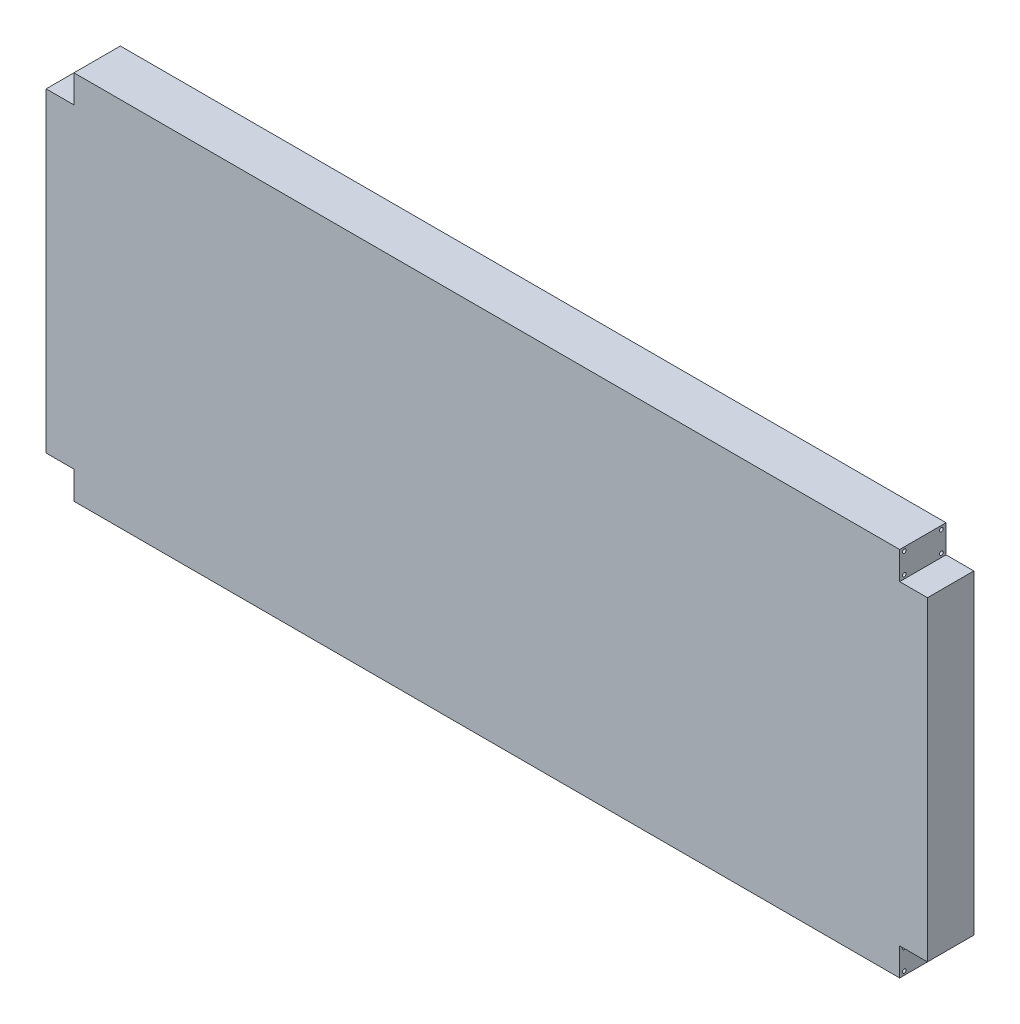
ISO-10303-21;
HEADER;
FILE_DESCRIPTION(('STEP AP214'),'2;1');
FILE_NAME('part.step','',(''),(''),'','','');
FILE_SCHEMA(('AUTOMOTIVE_DESIGN { 1 0 10303 214 1 1 1 1 }'));
ENDSEC;
DATA;
#1=APPLICATION_CONTEXT('core data for automotive mechanical design processes');
#2=APPLICATION_PROTOCOL_DEFINITION('international standard','automotive_design',2000,#1);
#3=PRODUCT_CONTEXT('',#1,'mechanical');
#4=PRODUCT('Part','Part','',(#3));
#5=PRODUCT_RELATED_PRODUCT_CATEGORY('part','',(#4));
#6=PRODUCT_DEFINITION_FORMATION('','',#4);
#7=PRODUCT_DEFINITION_CONTEXT('part definition',#1,'design');
#8=PRODUCT_DEFINITION('design','',#6,#7);
#9=PRODUCT_DEFINITION_SHAPE('','',#8);
#10=(LENGTH_UNIT() NAMED_UNIT(*) SI_UNIT(.MILLI.,.METRE.));
#11=(NAMED_UNIT(*) PLANE_ANGLE_UNIT() SI_UNIT($,.RADIAN.));
#12=(NAMED_UNIT(*) SI_UNIT($,.STERADIAN.) SOLID_ANGLE_UNIT());
#13=UNCERTAINTY_MEASURE_WITH_UNIT(LENGTH_MEASURE(1.E-05),#10,'distance_accuracy_value','');
#14=(GEOMETRIC_REPRESENTATION_CONTEXT(3) GLOBAL_UNCERTAINTY_ASSIGNED_CONTEXT((#13)) GLOBAL_UNIT_ASSIGNED_CONTEXT((#10,
#11,#12)) REPRESENTATION_CONTEXT('',''));
#15=CARTESIAN_POINT('',(0.,0.,0.));
#16=DIRECTION('',(0.,0.,1.));
#17=DIRECTION('',(1.,0.,0.));
#18=AXIS2_PLACEMENT_3D('',#15,#16,#17);
#19=CARTESIAN_POINT('',(475.,200.,50.));
#20=DIRECTION('',(-1.,0.,0.));
#21=DIRECTION('',(0.,0.,1.));
#22=AXIS2_PLACEMENT_3D('',#19,#20,#21);
#23=PLANE('',#22);
#24=DIRECTION('',(0.,1.,0.));
#25=VECTOR('',#24,1.);
#26=CARTESIAN_POINT('',(475.,200.,0.));
#27=LINE('',#26,#25);
#28=CARTESIAN_POINT('',(475.,-170.,0.));
#29=VERTEX_POINT('',#28);
#30=CARTESIAN_POINT('',(475.,170.,0.));
#31=VERTEX_POINT('',#30);
#32=EDGE_CURVE('E343',#29,#31,#27,.T.);
#33=ORIENTED_EDGE('',*,*,#32,.T.);
#34=DIRECTION('',(0.,0.,1.));
#35=VECTOR('',#34,1.);
#36=CARTESIAN_POINT('',(475.,170.,0.));
#37=LINE('',#36,#35);
#38=CARTESIAN_POINT('',(475.,170.,50.));
#39=VERTEX_POINT('',#38);
#40=EDGE_CURVE('E278',#31,#39,#37,.T.);
#41=ORIENTED_EDGE('',*,*,#40,.T.);
#42=DIRECTION('',(0.,1.,0.));
#43=VECTOR('',#42,1.);
#44=CARTESIAN_POINT('',(475.,200.,50.));
#45=LINE('',#44,#43);
#46=CARTESIAN_POINT('',(475.,-170.,50.));
#47=VERTEX_POINT('',#46);
#48=EDGE_CURVE('E347',#47,#39,#45,.T.);
#49=ORIENTED_EDGE('',*,*,#48,.F.);
#50=DIRECTION('',(0.,0.,1.));
#51=VECTOR('',#50,1.);
#52=CARTESIAN_POINT('',(475.,-170.,0.));
#53=LINE('',#52,#51);
#54=EDGE_CURVE('E299',#29,#47,#53,.T.);
#55=ORIENTED_EDGE('',*,*,#54,.F.);
#56=EDGE_LOOP('',(#33,#41,#49,#55));
#57=FACE_BOUND('',#56,.T.);
#58=ADVANCED_FACE('F37',(#57),#23,.F.);
#59=CARTESIAN_POINT('',(-475.,200.,50.));
#60=DIRECTION('',(0.,-1.,0.));
#61=DIRECTION('',(0.,0.,-1.));
#62=AXIS2_PLACEMENT_3D('',#59,#60,#61);
#63=PLANE('',#62);
#64=DIRECTION('',(-1.,0.,0.));
#65=VECTOR('',#64,1.);
#66=CARTESIAN_POINT('',(-475.,200.,50.));
#67=LINE('',#66,#65);
#68=CARTESIAN_POINT('',(445.,200.,50.));
#69=VERTEX_POINT('',#68);
#70=CARTESIAN_POINT('',(-445.,200.,50.));
#71=VERTEX_POINT('',#70);
#72=EDGE_CURVE('E350',#69,#71,#67,.T.);
#73=ORIENTED_EDGE('',*,*,#72,.F.);
#74=DIRECTION('',(0.,0.,1.));
#75=VECTOR('',#74,1.);
#76=CARTESIAN_POINT('',(445.,200.,0.));
#77=LINE('',#76,#75);
#78=CARTESIAN_POINT('',(445.,200.,0.));
#79=VERTEX_POINT('',#78);
#80=EDGE_CURVE('E315',#79,#69,#77,.T.);
#81=ORIENTED_EDGE('',*,*,#80,.F.);
#82=DIRECTION('',(-1.,0.,0.));
#83=VECTOR('',#82,1.);
#84=CARTESIAN_POINT('',(-475.,200.,0.));
#85=LINE('',#84,#83);
#86=CARTESIAN_POINT('',(-445.,200.,0.));
#87=VERTEX_POINT('',#86);
#88=EDGE_CURVE('E357',#79,#87,#85,.T.);
#89=ORIENTED_EDGE('',*,*,#88,.T.);
#90=DIRECTION('',(0.,0.,1.));
#91=VECTOR('',#90,1.);
#92=CARTESIAN_POINT('',(-445.,200.,0.));
#93=LINE('',#92,#91);
#94=EDGE_CURVE('E340',#87,#71,#93,.T.);
#95=ORIENTED_EDGE('',*,*,#94,.T.);
#96=EDGE_LOOP('',(#73,#81,#89,#95));
#97=FACE_BOUND('',#96,.T.);
#98=ADVANCED_FACE('F403',(#97),#63,.F.);
#99=CARTESIAN_POINT('',(-475.,200.,50.));
#100=DIRECTION('',(1.,0.,0.));
#101=DIRECTION('',(0.,1.,0.));
#102=AXIS2_PLACEMENT_3D('',#99,#100,#101);
#103=PLANE('',#102);
#104=DIRECTION('',(0.,-1.,0.));
#105=VECTOR('',#104,1.);
#106=CARTESIAN_POINT('',(-475.,200.,0.));
#107=LINE('',#106,#105);
#108=CARTESIAN_POINT('',(-475.,170.,0.));
#109=VERTEX_POINT('',#108);
#110=CARTESIAN_POINT('',(-475.,-170.,0.));
#111=VERTEX_POINT('',#110);
#112=EDGE_CURVE('E359',#109,#111,#107,.T.);
#113=ORIENTED_EDGE('',*,*,#112,.T.);
#114=DIRECTION('',(0.,0.,1.));
#115=VECTOR('',#114,1.);
#116=CARTESIAN_POINT('',(-475.,-170.,0.));
#117=LINE('',#116,#115);
#118=CARTESIAN_POINT('',(-475.,-170.,50.));
#119=VERTEX_POINT('',#118);
#120=EDGE_CURVE('E284',#111,#119,#117,.T.);
#121=ORIENTED_EDGE('',*,*,#120,.T.);
#122=DIRECTION('',(0.,-1.,0.));
#123=VECTOR('',#122,1.);
#124=CARTESIAN_POINT('',(-475.,200.,50.));
#125=LINE('',#124,#123);
#126=CARTESIAN_POINT('',(-475.,170.,50.));
#127=VERTEX_POINT('',#126);
#128=EDGE_CURVE('E45',#127,#119,#125,.T.);
#129=ORIENTED_EDGE('',*,*,#128,.F.);
#130=DIRECTION('',(0.,0.,1.));
#131=VECTOR('',#130,1.);
#132=CARTESIAN_POINT('',(-475.,170.,0.));
#133=LINE('',#132,#131);
#134=EDGE_CURVE('E336',#109,#127,#133,.T.);
#135=ORIENTED_EDGE('',*,*,#134,.F.);
#136=EDGE_LOOP('',(#113,#121,#129,#135));
#137=FACE_BOUND('',#136,.T.);
#138=ADVANCED_FACE('F407',(#137),#103,.F.);
#139=CARTESIAN_POINT('',(-475.,-200.,50.));
#140=DIRECTION('',(0.,1.,0.));
#141=DIRECTION('',(0.,0.,1.));
#142=AXIS2_PLACEMENT_3D('',#139,#140,#141);
#143=PLANE('',#142);
#144=DIRECTION('',(1.,0.,0.));
#145=VECTOR('',#144,1.);
#146=CARTESIAN_POINT('',(-475.,-200.,0.));
#147=LINE('',#146,#145);
#148=CARTESIAN_POINT('',(-445.,-200.,0.));
#149=VERTEX_POINT('',#148);
#150=CARTESIAN_POINT('',(445.,-200.,0.));
#151=VERTEX_POINT('',#150);
#152=EDGE_CURVE('E40',#149,#151,#147,.T.);
#153=ORIENTED_EDGE('',*,*,#152,.T.);
#154=DIRECTION('',(0.,0.,1.));
#155=VECTOR('',#154,1.);
#156=CARTESIAN_POINT('',(445.,-200.,0.));
#157=LINE('',#156,#155);
#158=CARTESIAN_POINT('',(445.,-200.,50.));
#159=VERTEX_POINT('',#158);
#160=EDGE_CURVE('E303',#151,#159,#157,.T.);
#161=ORIENTED_EDGE('',*,*,#160,.T.);
#162=DIRECTION('',(1.,0.,0.));
#163=VECTOR('',#162,1.);
#164=CARTESIAN_POINT('',(-475.,-200.,50.));
#165=LINE('',#164,#163);
#166=CARTESIAN_POINT('',(-445.,-200.,50.));
#167=VERTEX_POINT('',#166);
#168=EDGE_CURVE('E11',#167,#159,#165,.T.);
#169=ORIENTED_EDGE('',*,*,#168,.F.);
#170=DIRECTION('',(0.,0.,1.));
#171=VECTOR('',#170,1.);
#172=CARTESIAN_POINT('',(-445.,-200.,0.));
#173=LINE('',#172,#171);
#174=EDGE_CURVE('E279',#149,#167,#173,.T.);
#175=ORIENTED_EDGE('',*,*,#174,.F.);
#176=EDGE_LOOP('',(#153,#161,#169,#175));
#177=FACE_BOUND('',#176,.T.);
#178=ADVANCED_FACE('F368',(#177),#143,.F.);
#179=CARTESIAN_POINT('',(0.,0.,50.));
#180=DIRECTION('',(0.,0.,1.));
#181=DIRECTION('',(1.,0.,0.));
#182=AXIS2_PLACEMENT_3D('',#179,#180,#181);
#183=PLANE('',#182);
#184=DIRECTION('',(1.,0.,0.));
#185=VECTOR('',#184,1.);
#186=CARTESIAN_POINT('',(475.,170.,50.));
#187=LINE('',#186,#185);
#188=CARTESIAN_POINT('',(445.,170.,50.));
#189=VERTEX_POINT('',#188);
#190=EDGE_CURVE('E321',#189,#39,#187,.T.);
#191=ORIENTED_EDGE('',*,*,#190,.F.);
#192=DIRECTION('',(0.,-1.,0.));
#193=VECTOR('',#192,1.);
#194=CARTESIAN_POINT('',(445.,200.,50.));
#195=LINE('',#194,#193);
#196=EDGE_CURVE('E306',#69,#189,#195,.T.);
#197=ORIENTED_EDGE('',*,*,#196,.F.);
#198=ORIENTED_EDGE('',*,*,#72,.T.);
#199=DIRECTION('',(0.,1.,0.));
#200=VECTOR('',#199,1.);
#201=CARTESIAN_POINT('',(-445.,200.,50.));
#202=LINE('',#201,#200);
#203=CARTESIAN_POINT('',(-445.,170.,50.));
#204=VERTEX_POINT('',#203);
#205=EDGE_CURVE('E333',#204,#71,#202,.T.);
#206=ORIENTED_EDGE('',*,*,#205,.F.);
#207=DIRECTION('',(1.,0.,0.));
#208=VECTOR('',#207,1.);
#209=CARTESIAN_POINT('',(-475.,170.,50.));
#210=LINE('',#209,#208);
#211=EDGE_CURVE('E294',#127,#204,#210,.T.);
#212=ORIENTED_EDGE('',*,*,#211,.F.);
#213=ORIENTED_EDGE('',*,*,#128,.T.);
#214=DIRECTION('',(-1.,0.,0.));
#215=VECTOR('',#214,1.);
#216=CARTESIAN_POINT('',(-475.,-170.,50.));
#217=LINE('',#216,#215);
#218=CARTESIAN_POINT('',(-445.,-170.,50.));
#219=VERTEX_POINT('',#218);
#220=EDGE_CURVE('E288',#219,#119,#217,.T.);
#221=ORIENTED_EDGE('',*,*,#220,.F.);
#222=DIRECTION('',(0.,1.,0.));
#223=VECTOR('',#222,1.);
#224=CARTESIAN_POINT('',(-445.,-200.,50.));
#225=LINE('',#224,#223);
#226=EDGE_CURVE('E290',#167,#219,#225,.T.);
#227=ORIENTED_EDGE('',*,*,#226,.F.);
#228=ORIENTED_EDGE('',*,*,#168,.T.);
#229=DIRECTION('',(0.,-1.,0.));
#230=VECTOR('',#229,1.);
#231=CARTESIAN_POINT('',(445.,-200.,50.));
#232=LINE('',#231,#230);
#233=CARTESIAN_POINT('',(445.,-170.,50.));
#234=VERTEX_POINT('',#233);
#235=EDGE_CURVE('E307',#234,#159,#232,.T.);
#236=ORIENTED_EDGE('',*,*,#235,.F.);
#237=DIRECTION('',(-1.,0.,0.));
#238=VECTOR('',#237,1.);
#239=CARTESIAN_POINT('',(475.,-170.,50.));
#240=LINE('',#239,#238);
#241=EDGE_CURVE('E287',#47,#234,#240,.T.);
#242=ORIENTED_EDGE('',*,*,#241,.F.);
#243=ORIENTED_EDGE('',*,*,#48,.T.);
#244=EDGE_LOOP('',(#191,#197,#198,#206,#212,#213,#221,#227,#228,#236,#242,#243));
#245=FACE_BOUND('',#244,.T.);
#246=ADVANCED_FACE('F381',(#245),#183,.T.);
#247=CARTESIAN_POINT('',(0.,0.,0.));
#248=DIRECTION('',(0.,0.,1.));
#249=DIRECTION('',(1.,0.,0.));
#250=AXIS2_PLACEMENT_3D('',#247,#248,#249);
#251=PLANE('',#250);
#252=DIRECTION('',(0.,-1.,0.));
#253=VECTOR('',#252,1.);
#254=CARTESIAN_POINT('',(445.,200.,0.));
#255=LINE('',#254,#253);
#256=CARTESIAN_POINT('',(445.,170.,0.));
#257=VERTEX_POINT('',#256);
#258=EDGE_CURVE('E323',#79,#257,#255,.T.);
#259=ORIENTED_EDGE('',*,*,#258,.T.);
#260=DIRECTION('',(1.,0.,0.));
#261=VECTOR('',#260,1.);
#262=CARTESIAN_POINT('',(475.,170.,0.));
#263=LINE('',#262,#261);
#264=EDGE_CURVE('E53',#257,#31,#263,.T.);
#265=ORIENTED_EDGE('',*,*,#264,.T.);
#266=ORIENTED_EDGE('',*,*,#32,.F.);
#267=DIRECTION('',(-1.,0.,0.));
#268=VECTOR('',#267,1.);
#269=CARTESIAN_POINT('',(475.,-170.,0.));
#270=LINE('',#269,#268);
#271=CARTESIAN_POINT('',(445.,-170.,0.));
#272=VERTEX_POINT('',#271);
#273=EDGE_CURVE('E309',#29,#272,#270,.T.);
#274=ORIENTED_EDGE('',*,*,#273,.T.);
#275=DIRECTION('',(0.,-1.,0.));
#276=VECTOR('',#275,1.);
#277=CARTESIAN_POINT('',(445.,-200.,0.));
#278=LINE('',#277,#276);
#279=EDGE_CURVE('E61',#272,#151,#278,.T.);
#280=ORIENTED_EDGE('',*,*,#279,.T.);
#281=ORIENTED_EDGE('',*,*,#152,.F.);
#282=DIRECTION('',(0.,1.,0.));
#283=VECTOR('',#282,1.);
#284=CARTESIAN_POINT('',(-445.,-200.,0.));
#285=LINE('',#284,#283);
#286=CARTESIAN_POINT('',(-445.,-170.,0.));
#287=VERTEX_POINT('',#286);
#288=EDGE_CURVE('E291',#149,#287,#285,.T.);
#289=ORIENTED_EDGE('',*,*,#288,.T.);
#290=DIRECTION('',(-1.,0.,0.));
#291=VECTOR('',#290,1.);
#292=CARTESIAN_POINT('',(-475.,-170.,0.));
#293=LINE('',#292,#291);
#294=EDGE_CURVE('E281',#287,#111,#293,.T.);
#295=ORIENTED_EDGE('',*,*,#294,.T.);
#296=ORIENTED_EDGE('',*,*,#112,.F.);
#297=DIRECTION('',(1.,0.,0.));
#298=VECTOR('',#297,1.);
#299=CARTESIAN_POINT('',(-475.,170.,0.));
#300=LINE('',#299,#298);
#301=CARTESIAN_POINT('',(-445.,170.,0.));
#302=VERTEX_POINT('',#301);
#303=EDGE_CURVE('E329',#109,#302,#300,.T.);
#304=ORIENTED_EDGE('',*,*,#303,.T.);
#305=DIRECTION('',(0.,1.,0.));
#306=VECTOR('',#305,1.);
#307=CARTESIAN_POINT('',(-445.,200.,0.));
#308=LINE('',#307,#306);
#309=EDGE_CURVE('E332',#302,#87,#308,.T.);
#310=ORIENTED_EDGE('',*,*,#309,.T.);
#311=ORIENTED_EDGE('',*,*,#88,.F.);
#312=EDGE_LOOP('',(#259,#265,#266,#274,#280,#281,#289,#295,#296,#304,#310,#311));
#313=FACE_BOUND('',#312,.T.);
#314=ADVANCED_FACE('F371',(#313),#251,.F.);
#315=CARTESIAN_POINT('',(-445.,200.,0.));
#316=DIRECTION('',(1.,0.,0.));
#317=DIRECTION('',(0.,0.,-1.));
#318=AXIS2_PLACEMENT_3D('',#315,#316,#317);
#319=PLANE('',#318);
#320=CARTESIAN_POINT('',(-445.,174.,45.));
#321=DIRECTION('',(-1.,0.,0.));
#322=DIRECTION('',(0.,0.,1.));
#323=AXIS2_PLACEMENT_3D('',#320,#321,#322);
#324=CIRCLE('',#323,2.);
#325=CARTESIAN_POINT('',(-445.,174.,47.));
#326=VERTEX_POINT('',#325);
#327=EDGE_CURVE('E206',#326,#326,#324,.T.);
#328=ORIENTED_EDGE('',*,*,#327,.F.);
#329=EDGE_LOOP('',(#328));
#330=FACE_BOUND('',#329,.T.);
#331=CARTESIAN_POINT('',(-445.,196.,45.));
#332=DIRECTION('',(-1.,0.,0.));
#333=DIRECTION('',(0.,0.,1.));
#334=AXIS2_PLACEMENT_3D('',#331,#332,#333);
#335=CIRCLE('',#334,2.);
#336=CARTESIAN_POINT('',(-445.,196.,47.));
#337=VERTEX_POINT('',#336);
#338=EDGE_CURVE('E212',#337,#337,#335,.T.);
#339=ORIENTED_EDGE('',*,*,#338,.F.);
#340=EDGE_LOOP('',(#339));
#341=FACE_BOUND('',#340,.T.);
#342=CARTESIAN_POINT('',(-445.,196.,5.));
#343=DIRECTION('',(-1.,0.,0.));
#344=DIRECTION('',(0.,0.,1.));
#345=AXIS2_PLACEMENT_3D('',#342,#343,#344);
#346=CIRCLE('',#345,2.);
#347=CARTESIAN_POINT('',(-445.,196.,7.));
#348=VERTEX_POINT('',#347);
#349=EDGE_CURVE('E218',#348,#348,#346,.T.);
#350=ORIENTED_EDGE('',*,*,#349,.F.);
#351=EDGE_LOOP('',(#350));
#352=FACE_BOUND('',#351,.T.);
#353=CARTESIAN_POINT('',(-445.,174.,5.));
#354=DIRECTION('',(-1.,0.,0.));
#355=DIRECTION('',(0.,0.,1.));
#356=AXIS2_PLACEMENT_3D('',#353,#354,#355);
#357=CIRCLE('',#356,2.);
#358=CARTESIAN_POINT('',(-445.,174.,7.));
#359=VERTEX_POINT('',#358);
#360=EDGE_CURVE('E224',#359,#359,#357,.T.);
#361=ORIENTED_EDGE('',*,*,#360,.F.);
#362=EDGE_LOOP('',(#361));
#363=FACE_BOUND('',#362,.T.);
#364=ORIENTED_EDGE('',*,*,#205,.T.);
#365=ORIENTED_EDGE('',*,*,#94,.F.);
#366=ORIENTED_EDGE('',*,*,#309,.F.);
#367=DIRECTION('',(0.,0.,1.));
#368=VECTOR('',#367,1.);
#369=CARTESIAN_POINT('',(-445.,170.,0.));
#370=LINE('',#369,#368);
#371=EDGE_CURVE('E344',#302,#204,#370,.T.);
#372=ORIENTED_EDGE('',*,*,#371,.T.);
#373=EDGE_LOOP('',(#364,#365,#366,#372));
#374=FACE_BOUND('',#373,.T.);
#375=ADVANCED_FACE('F419',(#330,#341,#352,#363,#374),#319,.F.);
#376=CARTESIAN_POINT('',(-475.,170.,0.));
#377=DIRECTION('',(0.,-1.,0.));
#378=DIRECTION('',(0.,0.,-1.));
#379=AXIS2_PLACEMENT_3D('',#376,#377,#378);
#380=PLANE('',#379);
#381=ORIENTED_EDGE('',*,*,#211,.T.);
#382=ORIENTED_EDGE('',*,*,#371,.F.);
#383=ORIENTED_EDGE('',*,*,#303,.F.);
#384=ORIENTED_EDGE('',*,*,#134,.T.);
#385=EDGE_LOOP('',(#381,#382,#383,#384));
#386=FACE_BOUND('',#385,.T.);
#387=ADVANCED_FACE('F422',(#386),#380,.F.);
#388=CARTESIAN_POINT('',(-475.,-170.,0.));
#389=DIRECTION('',(0.,1.,0.));
#390=DIRECTION('',(0.,0.,1.));
#391=AXIS2_PLACEMENT_3D('',#388,#389,#390);
#392=PLANE('',#391);
#393=ORIENTED_EDGE('',*,*,#220,.T.);
#394=ORIENTED_EDGE('',*,*,#120,.F.);
#395=ORIENTED_EDGE('',*,*,#294,.F.);
#396=DIRECTION('',(0.,0.,1.));
#397=VECTOR('',#396,1.);
#398=CARTESIAN_POINT('',(-445.,-170.,0.));
#399=LINE('',#398,#397);
#400=EDGE_CURVE('E282',#287,#219,#399,.T.);
#401=ORIENTED_EDGE('',*,*,#400,.T.);
#402=EDGE_LOOP('',(#393,#394,#395,#401));
#403=FACE_BOUND('',#402,.T.);
#404=ADVANCED_FACE('F396',(#403),#392,.F.);
#405=CARTESIAN_POINT('',(-445.,-200.,0.));
#406=DIRECTION('',(1.,0.,0.));
#407=DIRECTION('',(0.,0.,-1.));
#408=AXIS2_PLACEMENT_3D('',#405,#406,#407);
#409=PLANE('',#408);
#410=CARTESIAN_POINT('',(-445.,-174.,5.));
#411=DIRECTION('',(-1.,0.,0.));
#412=DIRECTION('',(0.,0.,1.));
#413=AXIS2_PLACEMENT_3D('',#410,#411,#412);
#414=CIRCLE('',#413,2.);
#415=CARTESIAN_POINT('',(-445.,-174.,7.));
#416=VERTEX_POINT('',#415);
#417=EDGE_CURVE('E230',#416,#416,#414,.T.);
#418=ORIENTED_EDGE('',*,*,#417,.F.);
#419=EDGE_LOOP('',(#418));
#420=FACE_BOUND('',#419,.T.);
#421=CARTESIAN_POINT('',(-445.,-174.,45.));
#422=DIRECTION('',(-1.,0.,0.));
#423=DIRECTION('',(0.,0.,1.));
#424=AXIS2_PLACEMENT_3D('',#421,#422,#423);
#425=CIRCLE('',#424,2.);
#426=CARTESIAN_POINT('',(-445.,-174.,47.));
#427=VERTEX_POINT('',#426);
#428=EDGE_CURVE('E236',#427,#427,#425,.T.);
#429=ORIENTED_EDGE('',*,*,#428,.F.);
#430=EDGE_LOOP('',(#429));
#431=FACE_BOUND('',#430,.T.);
#432=CARTESIAN_POINT('',(-445.,-196.,45.));
#433=DIRECTION('',(-1.,0.,0.));
#434=DIRECTION('',(0.,0.,1.));
#435=AXIS2_PLACEMENT_3D('',#432,#433,#434);
#436=CIRCLE('',#435,2.);
#437=CARTESIAN_POINT('',(-445.,-196.,47.));
#438=VERTEX_POINT('',#437);
#439=EDGE_CURVE('E242',#438,#438,#436,.T.);
#440=ORIENTED_EDGE('',*,*,#439,.F.);
#441=EDGE_LOOP('',(#440));
#442=FACE_BOUND('',#441,.T.);
#443=CARTESIAN_POINT('',(-445.,-196.,5.));
#444=DIRECTION('',(-1.,0.,0.));
#445=DIRECTION('',(0.,0.,1.));
#446=AXIS2_PLACEMENT_3D('',#443,#444,#445);
#447=CIRCLE('',#446,2.);
#448=CARTESIAN_POINT('',(-445.,-196.,7.));
#449=VERTEX_POINT('',#448);
#450=EDGE_CURVE('E248',#449,#449,#447,.T.);
#451=ORIENTED_EDGE('',*,*,#450,.F.);
#452=EDGE_LOOP('',(#451));
#453=FACE_BOUND('',#452,.T.);
#454=ORIENTED_EDGE('',*,*,#226,.T.);
#455=ORIENTED_EDGE('',*,*,#400,.F.);
#456=ORIENTED_EDGE('',*,*,#288,.F.);
#457=ORIENTED_EDGE('',*,*,#174,.T.);
#458=EDGE_LOOP('',(#454,#455,#456,#457));
#459=FACE_BOUND('',#458,.T.);
#460=ADVANCED_FACE('F387',(#420,#431,#442,#453,#459),#409,.F.);
#461=CARTESIAN_POINT('',(445.,-200.,0.));
#462=DIRECTION('',(-1.,0.,0.));
#463=DIRECTION('',(0.,0.,1.));
#464=AXIS2_PLACEMENT_3D('',#461,#462,#463);
#465=PLANE('',#464);
#466=CARTESIAN_POINT('',(445.,-196.,45.));
#467=DIRECTION('',(1.,0.,0.));
#468=DIRECTION('',(0.,0.,-1.));
#469=AXIS2_PLACEMENT_3D('',#466,#467,#468);
#470=CIRCLE('',#469,2.);
#471=CARTESIAN_POINT('',(445.,-196.,43.));
#472=VERTEX_POINT('',#471);
#473=EDGE_CURVE('E254',#472,#472,#470,.T.);
#474=ORIENTED_EDGE('',*,*,#473,.F.);
#475=EDGE_LOOP('',(#474));
#476=FACE_BOUND('',#475,.T.);
#477=CARTESIAN_POINT('',(445.,-174.,45.));
#478=DIRECTION('',(1.,0.,0.));
#479=DIRECTION('',(0.,0.,-1.));
#480=AXIS2_PLACEMENT_3D('',#477,#478,#479);
#481=CIRCLE('',#480,2.);
#482=CARTESIAN_POINT('',(445.,-174.,43.));
#483=VERTEX_POINT('',#482);
#484=EDGE_CURVE('E260',#483,#483,#481,.T.);
#485=ORIENTED_EDGE('',*,*,#484,.F.);
#486=EDGE_LOOP('',(#485));
#487=FACE_BOUND('',#486,.T.);
#488=CARTESIAN_POINT('',(445.,-196.,5.));
#489=DIRECTION('',(1.,0.,0.));
#490=DIRECTION('',(0.,0.,-1.));
#491=AXIS2_PLACEMENT_3D('',#488,#489,#490);
#492=CIRCLE('',#491,2.);
#493=CARTESIAN_POINT('',(445.,-196.,3.));
#494=VERTEX_POINT('',#493);
#495=EDGE_CURVE('E266',#494,#494,#492,.T.);
#496=ORIENTED_EDGE('',*,*,#495,.F.);
#497=EDGE_LOOP('',(#496));
#498=FACE_BOUND('',#497,.T.);
#499=CARTESIAN_POINT('',(445.,-174.,5.));
#500=DIRECTION('',(1.,0.,0.));
#501=DIRECTION('',(0.,0.,-1.));
#502=AXIS2_PLACEMENT_3D('',#499,#500,#501);
#503=CIRCLE('',#502,2.);
#504=CARTESIAN_POINT('',(445.,-174.,3.));
#505=VERTEX_POINT('',#504);
#506=EDGE_CURVE('E272',#505,#505,#503,.T.);
#507=ORIENTED_EDGE('',*,*,#506,.F.);
#508=EDGE_LOOP('',(#507));
#509=FACE_BOUND('',#508,.T.);
#510=ORIENTED_EDGE('',*,*,#235,.T.);
#511=ORIENTED_EDGE('',*,*,#160,.F.);
#512=ORIENTED_EDGE('',*,*,#279,.F.);
#513=DIRECTION('',(0.,0.,1.));
#514=VECTOR('',#513,1.);
#515=CARTESIAN_POINT('',(445.,-170.,0.));
#516=LINE('',#515,#514);
#517=EDGE_CURVE('E301',#272,#234,#516,.T.);
#518=ORIENTED_EDGE('',*,*,#517,.T.);
#519=EDGE_LOOP('',(#510,#511,#512,#518));
#520=FACE_BOUND('',#519,.T.);
#521=ADVANCED_FACE('F385',(#476,#487,#498,#509,#520),#465,.F.);
#522=CARTESIAN_POINT('',(475.,-170.,0.));
#523=DIRECTION('',(0.,1.,0.));
#524=DIRECTION('',(0.,0.,1.));
#525=AXIS2_PLACEMENT_3D('',#522,#523,#524);
#526=PLANE('',#525);
#527=ORIENTED_EDGE('',*,*,#241,.T.);
#528=ORIENTED_EDGE('',*,*,#517,.F.);
#529=ORIENTED_EDGE('',*,*,#273,.F.);
#530=ORIENTED_EDGE('',*,*,#54,.T.);
#531=EDGE_LOOP('',(#527,#528,#529,#530));
#532=FACE_BOUND('',#531,.T.);
#533=ADVANCED_FACE('F375',(#532),#526,.F.);
#534=CARTESIAN_POINT('',(475.,170.,0.));
#535=DIRECTION('',(0.,-1.,0.));
#536=DIRECTION('',(0.,0.,-1.));
#537=AXIS2_PLACEMENT_3D('',#534,#535,#536);
#538=PLANE('',#537);
#539=ORIENTED_EDGE('',*,*,#190,.T.);
#540=ORIENTED_EDGE('',*,*,#40,.F.);
#541=ORIENTED_EDGE('',*,*,#264,.F.);
#542=DIRECTION('',(0.,0.,1.));
#543=VECTOR('',#542,1.);
#544=CARTESIAN_POINT('',(445.,170.,0.));
#545=LINE('',#544,#543);
#546=EDGE_CURVE('E317',#257,#189,#545,.T.);
#547=ORIENTED_EDGE('',*,*,#546,.T.);
#548=EDGE_LOOP('',(#539,#540,#541,#547));
#549=FACE_BOUND('',#548,.T.);
#550=ADVANCED_FACE('F394',(#549),#538,.F.);
#551=CARTESIAN_POINT('',(445.,200.,0.));
#552=DIRECTION('',(-1.,0.,0.));
#553=DIRECTION('',(0.,0.,1.));
#554=AXIS2_PLACEMENT_3D('',#551,#552,#553);
#555=PLANE('',#554);
#556=CARTESIAN_POINT('',(445.,174.,45.));
#557=DIRECTION('',(1.,0.,0.));
#558=DIRECTION('',(0.,0.,-1.));
#559=AXIS2_PLACEMENT_3D('',#556,#557,#558);
#560=CIRCLE('',#559,2.);
#561=CARTESIAN_POINT('',(445.,174.,43.));
#562=VERTEX_POINT('',#561);
#563=EDGE_CURVE('E184',#562,#562,#560,.T.);
#564=ORIENTED_EDGE('',*,*,#563,.F.);
#565=EDGE_LOOP('',(#564));
#566=FACE_BOUND('',#565,.T.);
#567=CARTESIAN_POINT('',(445.,196.,45.));
#568=DIRECTION('',(1.,0.,0.));
#569=DIRECTION('',(0.,0.,-1.));
#570=AXIS2_PLACEMENT_3D('',#567,#568,#569);
#571=CIRCLE('',#570,2.);
#572=CARTESIAN_POINT('',(445.,196.,43.));
#573=VERTEX_POINT('',#572);
#574=EDGE_CURVE('E183',#573,#573,#571,.T.);
#575=ORIENTED_EDGE('',*,*,#574,.F.);
#576=EDGE_LOOP('',(#575));
#577=FACE_BOUND('',#576,.T.);
#578=CARTESIAN_POINT('',(445.,174.,5.));
#579=DIRECTION('',(1.,0.,0.));
#580=DIRECTION('',(0.,0.,-1.));
#581=AXIS2_PLACEMENT_3D('',#578,#579,#580);
#582=CIRCLE('',#581,2.);
#583=CARTESIAN_POINT('',(445.,174.,3.));
#584=VERTEX_POINT('',#583);
#585=EDGE_CURVE('E194',#584,#584,#582,.T.);
#586=ORIENTED_EDGE('',*,*,#585,.F.);
#587=EDGE_LOOP('',(#586));
#588=FACE_BOUND('',#587,.T.);
#589=CARTESIAN_POINT('',(445.,196.,5.));
#590=DIRECTION('',(1.,0.,0.));
#591=DIRECTION('',(0.,0.,-1.));
#592=AXIS2_PLACEMENT_3D('',#589,#590,#591);
#593=CIRCLE('',#592,2.);
#594=CARTESIAN_POINT('',(445.,196.,3.));
#595=VERTEX_POINT('',#594);
#596=EDGE_CURVE('E200',#595,#595,#593,.T.);
#597=ORIENTED_EDGE('',*,*,#596,.F.);
#598=EDGE_LOOP('',(#597));
#599=FACE_BOUND('',#598,.T.);
#600=ORIENTED_EDGE('',*,*,#196,.T.);
#601=ORIENTED_EDGE('',*,*,#546,.F.);
#602=ORIENTED_EDGE('',*,*,#258,.F.);
#603=ORIENTED_EDGE('',*,*,#80,.T.);
#604=EDGE_LOOP('',(#600,#601,#602,#603));
#605=FACE_BOUND('',#604,.T.);
#606=ADVANCED_FACE('F430',(#566,#577,#588,#599,#605),#555,.F.);
#607=CARTESIAN_POINT('',(415.,-174.,5.));
#608=DIRECTION('',(1.,0.,0.));
#609=DIRECTION('',(0.,0.,-1.));
#610=AXIS2_PLACEMENT_3D('',#607,#608,#609);
#611=CONICAL_SURFACE('',#610,1.99999999999997,1.02974425867667);
#612=CARTESIAN_POINT('',(413.798278761945,-174.,5.));
#613=VERTEX_POINT('',#612);
#614=VERTEX_LOOP('',#613);
#615=FACE_BOUND('',#614,.T.);
#616=CARTESIAN_POINT('',(415.,-174.,5.));
#617=DIRECTION('',(1.,0.,0.));
#618=DIRECTION('',(0.,0.,-1.));
#619=AXIS2_PLACEMENT_3D('',#616,#617,#618);
#620=CIRCLE('',#619,1.99999999999997);
#621=CARTESIAN_POINT('',(415.,-174.,3.00000000000003));
#622=VERTEX_POINT('',#621);
#623=EDGE_CURVE('E275',#622,#622,#620,.T.);
#624=ORIENTED_EDGE('',*,*,#623,.T.);
#625=EDGE_LOOP('',(#624));
#626=FACE_BOUND('',#625,.T.);
#627=ADVANCED_FACE('F432',(#615,#626),#611,.F.);
#628=CARTESIAN_POINT('',(445.,-174.,5.));
#629=DIRECTION('',(1.,0.,0.));
#630=DIRECTION('',(0.,0.,-1.));
#631=AXIS2_PLACEMENT_3D('',#628,#629,#630);
#632=CYLINDRICAL_SURFACE('',#631,1.99999999999999);
#633=ORIENTED_EDGE('',*,*,#623,.F.);
#634=EDGE_LOOP('',(#633));
#635=FACE_BOUND('',#634,.T.);
#636=ORIENTED_EDGE('',*,*,#506,.T.);
#637=EDGE_LOOP('',(#636));
#638=FACE_BOUND('',#637,.T.);
#639=ADVANCED_FACE('F437',(#635,#638),#632,.F.);
#640=CARTESIAN_POINT('',(415.,-196.,5.));
#641=DIRECTION('',(1.,0.,0.));
#642=DIRECTION('',(0.,0.,-1.));
#643=AXIS2_PLACEMENT_3D('',#640,#641,#642);
#644=CONICAL_SURFACE('',#643,1.99999999999997,1.02974425867667);
#645=CARTESIAN_POINT('',(413.798278761945,-196.,5.));
#646=VERTEX_POINT('',#645);
#647=VERTEX_LOOP('',#646);
#648=FACE_BOUND('',#647,.T.);
#649=CARTESIAN_POINT('',(415.,-196.,5.));
#650=DIRECTION('',(1.,0.,0.));
#651=DIRECTION('',(0.,0.,-1.));
#652=AXIS2_PLACEMENT_3D('',#649,#650,#651);
#653=CIRCLE('',#652,1.99999999999997);
#654=CARTESIAN_POINT('',(415.,-196.,3.00000000000003));
#655=VERTEX_POINT('',#654);
#656=EDGE_CURVE('E269',#655,#655,#653,.T.);
#657=ORIENTED_EDGE('',*,*,#656,.T.);
#658=EDGE_LOOP('',(#657));
#659=FACE_BOUND('',#658,.T.);
#660=ADVANCED_FACE('F466',(#648,#659),#644,.F.);
#661=CARTESIAN_POINT('',(445.,-196.,5.));
#662=DIRECTION('',(1.,0.,0.));
#663=DIRECTION('',(0.,0.,-1.));
#664=AXIS2_PLACEMENT_3D('',#661,#662,#663);
#665=CYLINDRICAL_SURFACE('',#664,1.99999999999999);
#666=ORIENTED_EDGE('',*,*,#656,.F.);
#667=EDGE_LOOP('',(#666));
#668=FACE_BOUND('',#667,.T.);
#669=ORIENTED_EDGE('',*,*,#495,.T.);
#670=EDGE_LOOP('',(#669));
#671=FACE_BOUND('',#670,.T.);
#672=ADVANCED_FACE('F470',(#668,#671),#665,.F.);
#673=CARTESIAN_POINT('',(415.,-174.,45.));
#674=DIRECTION('',(1.,0.,0.));
#675=DIRECTION('',(0.,0.,-1.));
#676=AXIS2_PLACEMENT_3D('',#673,#674,#675);
#677=CONICAL_SURFACE('',#676,1.99999999999997,1.02974425867667);
#678=CARTESIAN_POINT('',(413.798278761945,-174.,45.));
#679=VERTEX_POINT('',#678);
#680=VERTEX_LOOP('',#679);
#681=FACE_BOUND('',#680,.T.);
#682=CARTESIAN_POINT('',(415.,-174.,45.));
#683=DIRECTION('',(1.,0.,0.));
#684=DIRECTION('',(0.,0.,-1.));
#685=AXIS2_PLACEMENT_3D('',#682,#683,#684);
#686=CIRCLE('',#685,1.99999999999997);
#687=CARTESIAN_POINT('',(415.,-174.,43.));
#688=VERTEX_POINT('',#687);
#689=EDGE_CURVE('E263',#688,#688,#686,.T.);
#690=ORIENTED_EDGE('',*,*,#689,.T.);
#691=EDGE_LOOP('',(#690));
#692=FACE_BOUND('',#691,.T.);
#693=ADVANCED_FACE('F474',(#681,#692),#677,.F.);
#694=CARTESIAN_POINT('',(445.,-174.,45.));
#695=DIRECTION('',(1.,0.,0.));
#696=DIRECTION('',(0.,0.,-1.));
#697=AXIS2_PLACEMENT_3D('',#694,#695,#696);
#698=CYLINDRICAL_SURFACE('',#697,1.99999999999999);
#699=ORIENTED_EDGE('',*,*,#689,.F.);
#700=EDGE_LOOP('',(#699));
#701=FACE_BOUND('',#700,.T.);
#702=ORIENTED_EDGE('',*,*,#484,.T.);
#703=EDGE_LOOP('',(#702));
#704=FACE_BOUND('',#703,.T.);
#705=ADVANCED_FACE('F478',(#701,#704),#698,.F.);
#706=CARTESIAN_POINT('',(415.,-196.,45.));
#707=DIRECTION('',(1.,0.,0.));
#708=DIRECTION('',(0.,0.,-1.));
#709=AXIS2_PLACEMENT_3D('',#706,#707,#708);
#710=CONICAL_SURFACE('',#709,1.99999999999997,1.02974425867667);
#711=CARTESIAN_POINT('',(413.798278761945,-196.,45.));
#712=VERTEX_POINT('',#711);
#713=VERTEX_LOOP('',#712);
#714=FACE_BOUND('',#713,.T.);
#715=CARTESIAN_POINT('',(415.,-196.,45.));
#716=DIRECTION('',(1.,0.,0.));
#717=DIRECTION('',(0.,0.,-1.));
#718=AXIS2_PLACEMENT_3D('',#715,#716,#717);
#719=CIRCLE('',#718,1.99999999999997);
#720=CARTESIAN_POINT('',(415.,-196.,43.));
#721=VERTEX_POINT('',#720);
#722=EDGE_CURVE('E257',#721,#721,#719,.T.);
#723=ORIENTED_EDGE('',*,*,#722,.T.);
#724=EDGE_LOOP('',(#723));
#725=FACE_BOUND('',#724,.T.);
#726=ADVANCED_FACE('F482',(#714,#725),#710,.F.);
#727=CARTESIAN_POINT('',(445.,-196.,45.));
#728=DIRECTION('',(1.,0.,0.));
#729=DIRECTION('',(0.,0.,-1.));
#730=AXIS2_PLACEMENT_3D('',#727,#728,#729);
#731=CYLINDRICAL_SURFACE('',#730,1.99999999999999);
#732=ORIENTED_EDGE('',*,*,#722,.F.);
#733=EDGE_LOOP('',(#732));
#734=FACE_BOUND('',#733,.T.);
#735=ORIENTED_EDGE('',*,*,#473,.T.);
#736=EDGE_LOOP('',(#735));
#737=FACE_BOUND('',#736,.T.);
#738=ADVANCED_FACE('F486',(#734,#737),#731,.F.);
#739=CARTESIAN_POINT('',(-415.,-196.,5.));
#740=DIRECTION('',(-1.,0.,0.));
#741=DIRECTION('',(0.,0.,1.));
#742=AXIS2_PLACEMENT_3D('',#739,#740,#741);
#743=CONICAL_SURFACE('',#742,1.99999999999997,1.02974425867665);
#744=CARTESIAN_POINT('',(-413.798278761945,-196.,5.));
#745=VERTEX_POINT('',#744);
#746=VERTEX_LOOP('',#745);
#747=FACE_BOUND('',#746,.T.);
#748=CARTESIAN_POINT('',(-415.,-196.,5.));
#749=DIRECTION('',(-1.,0.,0.));
#750=DIRECTION('',(0.,0.,1.));
#751=AXIS2_PLACEMENT_3D('',#748,#749,#750);
#752=CIRCLE('',#751,1.99999999999997);
#753=CARTESIAN_POINT('',(-415.,-196.,6.99999999999997));
#754=VERTEX_POINT('',#753);
#755=EDGE_CURVE('E251',#754,#754,#752,.T.);
#756=ORIENTED_EDGE('',*,*,#755,.T.);
#757=EDGE_LOOP('',(#756));
#758=FACE_BOUND('',#757,.T.);
#759=ADVANCED_FACE('F490',(#747,#758),#743,.F.);
#760=CARTESIAN_POINT('',(-445.,-196.,5.));
#761=DIRECTION('',(-1.,0.,0.));
#762=DIRECTION('',(0.,0.,1.));
#763=AXIS2_PLACEMENT_3D('',#760,#761,#762);
#764=CYLINDRICAL_SURFACE('',#763,1.99999999999999);
#765=ORIENTED_EDGE('',*,*,#755,.F.);
#766=EDGE_LOOP('',(#765));
#767=FACE_BOUND('',#766,.T.);
#768=ORIENTED_EDGE('',*,*,#450,.T.);
#769=EDGE_LOOP('',(#768));
#770=FACE_BOUND('',#769,.T.);
#771=ADVANCED_FACE('F494',(#767,#770),#764,.F.);
#772=CARTESIAN_POINT('',(-415.,-196.,45.));
#773=DIRECTION('',(-1.,0.,0.));
#774=DIRECTION('',(0.,0.,1.));
#775=AXIS2_PLACEMENT_3D('',#772,#773,#774);
#776=CONICAL_SURFACE('',#775,1.99999999999997,1.02974425867665);
#777=CARTESIAN_POINT('',(-413.798278761945,-196.,45.));
#778=VERTEX_POINT('',#777);
#779=VERTEX_LOOP('',#778);
#780=FACE_BOUND('',#779,.T.);
#781=CARTESIAN_POINT('',(-415.,-196.,45.));
#782=DIRECTION('',(-1.,0.,0.));
#783=DIRECTION('',(0.,0.,1.));
#784=AXIS2_PLACEMENT_3D('',#781,#782,#783);
#785=CIRCLE('',#784,1.99999999999997);
#786=CARTESIAN_POINT('',(-415.,-196.,47.));
#787=VERTEX_POINT('',#786);
#788=EDGE_CURVE('E245',#787,#787,#785,.T.);
#789=ORIENTED_EDGE('',*,*,#788,.T.);
#790=EDGE_LOOP('',(#789));
#791=FACE_BOUND('',#790,.T.);
#792=ADVANCED_FACE('F498',(#780,#791),#776,.F.);
#793=CARTESIAN_POINT('',(-445.,-196.,45.));
#794=DIRECTION('',(-1.,0.,0.));
#795=DIRECTION('',(0.,0.,1.));
#796=AXIS2_PLACEMENT_3D('',#793,#794,#795);
#797=CYLINDRICAL_SURFACE('',#796,1.99999999999999);
#798=ORIENTED_EDGE('',*,*,#788,.F.);
#799=EDGE_LOOP('',(#798));
#800=FACE_BOUND('',#799,.T.);
#801=ORIENTED_EDGE('',*,*,#439,.T.);
#802=EDGE_LOOP('',(#801));
#803=FACE_BOUND('',#802,.T.);
#804=ADVANCED_FACE('F502',(#800,#803),#797,.F.);
#805=CARTESIAN_POINT('',(-415.,-174.,45.));
#806=DIRECTION('',(-1.,0.,0.));
#807=DIRECTION('',(0.,0.,1.));
#808=AXIS2_PLACEMENT_3D('',#805,#806,#807);
#809=CONICAL_SURFACE('',#808,1.99999999999997,1.02974425867665);
#810=CARTESIAN_POINT('',(-413.798278761945,-174.,45.));
#811=VERTEX_POINT('',#810);
#812=VERTEX_LOOP('',#811);
#813=FACE_BOUND('',#812,.T.);
#814=CARTESIAN_POINT('',(-415.,-174.,45.));
#815=DIRECTION('',(-1.,0.,0.));
#816=DIRECTION('',(0.,0.,1.));
#817=AXIS2_PLACEMENT_3D('',#814,#815,#816);
#818=CIRCLE('',#817,1.99999999999997);
#819=CARTESIAN_POINT('',(-415.,-174.,47.));
#820=VERTEX_POINT('',#819);
#821=EDGE_CURVE('E239',#820,#820,#818,.T.);
#822=ORIENTED_EDGE('',*,*,#821,.T.);
#823=EDGE_LOOP('',(#822));
#824=FACE_BOUND('',#823,.T.);
#825=ADVANCED_FACE('F506',(#813,#824),#809,.F.);
#826=CARTESIAN_POINT('',(-445.,-174.,45.));
#827=DIRECTION('',(-1.,0.,0.));
#828=DIRECTION('',(0.,0.,1.));
#829=AXIS2_PLACEMENT_3D('',#826,#827,#828);
#830=CYLINDRICAL_SURFACE('',#829,1.99999999999999);
#831=ORIENTED_EDGE('',*,*,#821,.F.);
#832=EDGE_LOOP('',(#831));
#833=FACE_BOUND('',#832,.T.);
#834=ORIENTED_EDGE('',*,*,#428,.T.);
#835=EDGE_LOOP('',(#834));
#836=FACE_BOUND('',#835,.T.);
#837=ADVANCED_FACE('F510',(#833,#836),#830,.F.);
#838=CARTESIAN_POINT('',(-415.,-174.,5.));
#839=DIRECTION('',(-1.,0.,0.));
#840=DIRECTION('',(0.,0.,1.));
#841=AXIS2_PLACEMENT_3D('',#838,#839,#840);
#842=CONICAL_SURFACE('',#841,1.99999999999997,1.02974425867665);
#843=CARTESIAN_POINT('',(-413.798278761945,-174.,5.));
#844=VERTEX_POINT('',#843);
#845=VERTEX_LOOP('',#844);
#846=FACE_BOUND('',#845,.T.);
#847=CARTESIAN_POINT('',(-415.,-174.,5.));
#848=DIRECTION('',(-1.,0.,0.));
#849=DIRECTION('',(0.,0.,1.));
#850=AXIS2_PLACEMENT_3D('',#847,#848,#849);
#851=CIRCLE('',#850,1.99999999999997);
#852=CARTESIAN_POINT('',(-415.,-174.,6.99999999999997));
#853=VERTEX_POINT('',#852);
#854=EDGE_CURVE('E233',#853,#853,#851,.T.);
#855=ORIENTED_EDGE('',*,*,#854,.T.);
#856=EDGE_LOOP('',(#855));
#857=FACE_BOUND('',#856,.T.);
#858=ADVANCED_FACE('F514',(#846,#857),#842,.F.);
#859=CARTESIAN_POINT('',(-445.,-174.,5.));
#860=DIRECTION('',(-1.,0.,0.));
#861=DIRECTION('',(0.,0.,1.));
#862=AXIS2_PLACEMENT_3D('',#859,#860,#861);
#863=CYLINDRICAL_SURFACE('',#862,1.99999999999999);
#864=ORIENTED_EDGE('',*,*,#854,.F.);
#865=EDGE_LOOP('',(#864));
#866=FACE_BOUND('',#865,.T.);
#867=ORIENTED_EDGE('',*,*,#417,.T.);
#868=EDGE_LOOP('',(#867));
#869=FACE_BOUND('',#868,.T.);
#870=ADVANCED_FACE('F518',(#866,#869),#863,.F.);
#871=CARTESIAN_POINT('',(-415.,174.,5.));
#872=DIRECTION('',(-1.,0.,0.));
#873=DIRECTION('',(0.,0.,1.));
#874=AXIS2_PLACEMENT_3D('',#871,#872,#873);
#875=CONICAL_SURFACE('',#874,1.99999999999997,1.02974425867665);
#876=CARTESIAN_POINT('',(-413.798278761945,174.,5.));
#877=VERTEX_POINT('',#876);
#878=VERTEX_LOOP('',#877);
#879=FACE_BOUND('',#878,.T.);
#880=CARTESIAN_POINT('',(-415.,174.,5.));
#881=DIRECTION('',(-1.,0.,0.));
#882=DIRECTION('',(0.,0.,1.));
#883=AXIS2_PLACEMENT_3D('',#880,#881,#882);
#884=CIRCLE('',#883,1.99999999999997);
#885=CARTESIAN_POINT('',(-415.,174.,6.99999999999997));
#886=VERTEX_POINT('',#885);
#887=EDGE_CURVE('E227',#886,#886,#884,.T.);
#888=ORIENTED_EDGE('',*,*,#887,.T.);
#889=EDGE_LOOP('',(#888));
#890=FACE_BOUND('',#889,.T.);
#891=ADVANCED_FACE('F522',(#879,#890),#875,.F.);
#892=CARTESIAN_POINT('',(-445.,174.,5.));
#893=DIRECTION('',(-1.,0.,0.));
#894=DIRECTION('',(0.,0.,1.));
#895=AXIS2_PLACEMENT_3D('',#892,#893,#894);
#896=CYLINDRICAL_SURFACE('',#895,1.99999999999999);
#897=ORIENTED_EDGE('',*,*,#887,.F.);
#898=EDGE_LOOP('',(#897));
#899=FACE_BOUND('',#898,.T.);
#900=ORIENTED_EDGE('',*,*,#360,.T.);
#901=EDGE_LOOP('',(#900));
#902=FACE_BOUND('',#901,.T.);
#903=ADVANCED_FACE('F526',(#899,#902),#896,.F.);
#904=CARTESIAN_POINT('',(-415.,196.,5.));
#905=DIRECTION('',(-1.,0.,0.));
#906=DIRECTION('',(0.,0.,1.));
#907=AXIS2_PLACEMENT_3D('',#904,#905,#906);
#908=CONICAL_SURFACE('',#907,1.99999999999997,1.02974425867665);
#909=CARTESIAN_POINT('',(-413.798278761945,196.,5.));
#910=VERTEX_POINT('',#909);
#911=VERTEX_LOOP('',#910);
#912=FACE_BOUND('',#911,.T.);
#913=CARTESIAN_POINT('',(-415.,196.,5.));
#914=DIRECTION('',(-1.,0.,0.));
#915=DIRECTION('',(0.,0.,1.));
#916=AXIS2_PLACEMENT_3D('',#913,#914,#915);
#917=CIRCLE('',#916,1.99999999999997);
#918=CARTESIAN_POINT('',(-415.,196.,6.99999999999997));
#919=VERTEX_POINT('',#918);
#920=EDGE_CURVE('E221',#919,#919,#917,.T.);
#921=ORIENTED_EDGE('',*,*,#920,.T.);
#922=EDGE_LOOP('',(#921));
#923=FACE_BOUND('',#922,.T.);
#924=ADVANCED_FACE('F530',(#912,#923),#908,.F.);
#925=CARTESIAN_POINT('',(-445.,196.,5.));
#926=DIRECTION('',(-1.,0.,0.));
#927=DIRECTION('',(0.,0.,1.));
#928=AXIS2_PLACEMENT_3D('',#925,#926,#927);
#929=CYLINDRICAL_SURFACE('',#928,1.99999999999999);
#930=ORIENTED_EDGE('',*,*,#920,.F.);
#931=EDGE_LOOP('',(#930));
#932=FACE_BOUND('',#931,.T.);
#933=ORIENTED_EDGE('',*,*,#349,.T.);
#934=EDGE_LOOP('',(#933));
#935=FACE_BOUND('',#934,.T.);
#936=ADVANCED_FACE('F534',(#932,#935),#929,.F.);
#937=CARTESIAN_POINT('',(-415.,196.,45.));
#938=DIRECTION('',(-1.,0.,0.));
#939=DIRECTION('',(0.,0.,1.));
#940=AXIS2_PLACEMENT_3D('',#937,#938,#939);
#941=CONICAL_SURFACE('',#940,1.99999999999997,1.02974425867665);
#942=CARTESIAN_POINT('',(-413.798278761945,196.,45.));
#943=VERTEX_POINT('',#942);
#944=VERTEX_LOOP('',#943);
#945=FACE_BOUND('',#944,.T.);
#946=CARTESIAN_POINT('',(-415.,196.,45.));
#947=DIRECTION('',(-1.,0.,0.));
#948=DIRECTION('',(0.,0.,1.));
#949=AXIS2_PLACEMENT_3D('',#946,#947,#948);
#950=CIRCLE('',#949,1.99999999999997);
#951=CARTESIAN_POINT('',(-415.,196.,47.));
#952=VERTEX_POINT('',#951);
#953=EDGE_CURVE('E215',#952,#952,#950,.T.);
#954=ORIENTED_EDGE('',*,*,#953,.T.);
#955=EDGE_LOOP('',(#954));
#956=FACE_BOUND('',#955,.T.);
#957=ADVANCED_FACE('F538',(#945,#956),#941,.F.);
#958=CARTESIAN_POINT('',(-445.,196.,45.));
#959=DIRECTION('',(-1.,0.,0.));
#960=DIRECTION('',(0.,0.,1.));
#961=AXIS2_PLACEMENT_3D('',#958,#959,#960);
#962=CYLINDRICAL_SURFACE('',#961,1.99999999999999);
#963=ORIENTED_EDGE('',*,*,#953,.F.);
#964=EDGE_LOOP('',(#963));
#965=FACE_BOUND('',#964,.T.);
#966=ORIENTED_EDGE('',*,*,#338,.T.);
#967=EDGE_LOOP('',(#966));
#968=FACE_BOUND('',#967,.T.);
#969=ADVANCED_FACE('F542',(#965,#968),#962,.F.);
#970=CARTESIAN_POINT('',(-415.,174.,45.));
#971=DIRECTION('',(-1.,0.,0.));
#972=DIRECTION('',(0.,0.,1.));
#973=AXIS2_PLACEMENT_3D('',#970,#971,#972);
#974=CONICAL_SURFACE('',#973,1.99999999999997,1.02974425867665);
#975=CARTESIAN_POINT('',(-413.798278761945,174.,45.));
#976=VERTEX_POINT('',#975);
#977=VERTEX_LOOP('',#976);
#978=FACE_BOUND('',#977,.T.);
#979=CARTESIAN_POINT('',(-415.,174.,45.));
#980=DIRECTION('',(-1.,0.,0.));
#981=DIRECTION('',(0.,0.,1.));
#982=AXIS2_PLACEMENT_3D('',#979,#980,#981);
#983=CIRCLE('',#982,1.99999999999997);
#984=CARTESIAN_POINT('',(-415.,174.,47.));
#985=VERTEX_POINT('',#984);
#986=EDGE_CURVE('E209',#985,#985,#983,.T.);
#987=ORIENTED_EDGE('',*,*,#986,.T.);
#988=EDGE_LOOP('',(#987));
#989=FACE_BOUND('',#988,.T.);
#990=ADVANCED_FACE('F546',(#978,#989),#974,.F.);
#991=CARTESIAN_POINT('',(-445.,174.,45.));
#992=DIRECTION('',(-1.,0.,0.));
#993=DIRECTION('',(0.,0.,1.));
#994=AXIS2_PLACEMENT_3D('',#991,#992,#993);
#995=CYLINDRICAL_SURFACE('',#994,1.99999999999999);
#996=ORIENTED_EDGE('',*,*,#986,.F.);
#997=EDGE_LOOP('',(#996));
#998=FACE_BOUND('',#997,.T.);
#999=ORIENTED_EDGE('',*,*,#327,.T.);
#1000=EDGE_LOOP('',(#999));
#1001=FACE_BOUND('',#1000,.T.);
#1002=ADVANCED_FACE('F550',(#998,#1001),#995,.F.);
#1003=CARTESIAN_POINT('',(415.,196.,5.));
#1004=DIRECTION('',(1.,0.,0.));
#1005=DIRECTION('',(0.,0.,-1.));
#1006=AXIS2_PLACEMENT_3D('',#1003,#1004,#1005);
#1007=CONICAL_SURFACE('',#1006,1.99999999999997,1.02974425867665);
#1008=CARTESIAN_POINT('',(413.798278761945,196.,5.));
#1009=VERTEX_POINT('',#1008);
#1010=VERTEX_LOOP('',#1009);
#1011=FACE_BOUND('',#1010,.T.);
#1012=CARTESIAN_POINT('',(415.,196.,5.));
#1013=DIRECTION('',(1.,0.,0.));
#1014=DIRECTION('',(0.,0.,-1.));
#1015=AXIS2_PLACEMENT_3D('',#1012,#1013,#1014);
#1016=CIRCLE('',#1015,1.99999999999997);
#1017=CARTESIAN_POINT('',(415.,196.,3.00000000000003));
#1018=VERTEX_POINT('',#1017);
#1019=EDGE_CURVE('E203',#1018,#1018,#1016,.T.);
#1020=ORIENTED_EDGE('',*,*,#1019,.T.);
#1021=EDGE_LOOP('',(#1020));
#1022=FACE_BOUND('',#1021,.T.);
#1023=ADVANCED_FACE('F554',(#1011,#1022),#1007,.F.);
#1024=CARTESIAN_POINT('',(445.,196.,5.));
#1025=DIRECTION('',(1.,0.,0.));
#1026=DIRECTION('',(0.,0.,-1.));
#1027=AXIS2_PLACEMENT_3D('',#1024,#1025,#1026);
#1028=CYLINDRICAL_SURFACE('',#1027,1.99999999999999);
#1029=ORIENTED_EDGE('',*,*,#1019,.F.);
#1030=EDGE_LOOP('',(#1029));
#1031=FACE_BOUND('',#1030,.T.);
#1032=ORIENTED_EDGE('',*,*,#596,.T.);
#1033=EDGE_LOOP('',(#1032));
#1034=FACE_BOUND('',#1033,.T.);
#1035=ADVANCED_FACE('F558',(#1031,#1034),#1028,.F.);
#1036=CARTESIAN_POINT('',(415.,174.,5.));
#1037=DIRECTION('',(1.,0.,0.));
#1038=DIRECTION('',(0.,0.,-1.));
#1039=AXIS2_PLACEMENT_3D('',#1036,#1037,#1038);
#1040=CONICAL_SURFACE('',#1039,1.99999999999997,1.02974425867665);
#1041=CARTESIAN_POINT('',(413.798278761945,174.,5.));
#1042=VERTEX_POINT('',#1041);
#1043=VERTEX_LOOP('',#1042);
#1044=FACE_BOUND('',#1043,.T.);
#1045=CARTESIAN_POINT('',(415.,174.,5.));
#1046=DIRECTION('',(1.,0.,0.));
#1047=DIRECTION('',(0.,0.,-1.));
#1048=AXIS2_PLACEMENT_3D('',#1045,#1046,#1047);
#1049=CIRCLE('',#1048,1.99999999999997);
#1050=CARTESIAN_POINT('',(415.,174.,3.00000000000003));
#1051=VERTEX_POINT('',#1050);
#1052=EDGE_CURVE('E197',#1051,#1051,#1049,.T.);
#1053=ORIENTED_EDGE('',*,*,#1052,.T.);
#1054=EDGE_LOOP('',(#1053));
#1055=FACE_BOUND('',#1054,.T.);
#1056=ADVANCED_FACE('F562',(#1044,#1055),#1040,.F.);
#1057=CARTESIAN_POINT('',(445.,174.,5.));
#1058=DIRECTION('',(1.,0.,0.));
#1059=DIRECTION('',(0.,0.,-1.));
#1060=AXIS2_PLACEMENT_3D('',#1057,#1058,#1059);
#1061=CYLINDRICAL_SURFACE('',#1060,1.99999999999999);
#1062=ORIENTED_EDGE('',*,*,#1052,.F.);
#1063=EDGE_LOOP('',(#1062));
#1064=FACE_BOUND('',#1063,.T.);
#1065=ORIENTED_EDGE('',*,*,#585,.T.);
#1066=EDGE_LOOP('',(#1065));
#1067=FACE_BOUND('',#1066,.T.);
#1068=ADVANCED_FACE('F566',(#1064,#1067),#1061,.F.);
#1069=CARTESIAN_POINT('',(415.,196.,45.));
#1070=DIRECTION('',(1.,0.,0.));
#1071=DIRECTION('',(0.,0.,-1.));
#1072=AXIS2_PLACEMENT_3D('',#1069,#1070,#1071);
#1073=CONICAL_SURFACE('',#1072,1.99999999999997,1.02974425867665);
#1074=CARTESIAN_POINT('',(413.798278761945,196.,45.));
#1075=VERTEX_POINT('',#1074);
#1076=VERTEX_LOOP('',#1075);
#1077=FACE_BOUND('',#1076,.T.);
#1078=CARTESIAN_POINT('',(415.,196.,45.));
#1079=DIRECTION('',(1.,0.,0.));
#1080=DIRECTION('',(0.,0.,-1.));
#1081=AXIS2_PLACEMENT_3D('',#1078,#1079,#1080);
#1082=CIRCLE('',#1081,1.99999999999997);
#1083=CARTESIAN_POINT('',(415.,196.,43.));
#1084=VERTEX_POINT('',#1083);
#1085=EDGE_CURVE('E187',#1084,#1084,#1082,.T.);
#1086=ORIENTED_EDGE('',*,*,#1085,.T.);
#1087=EDGE_LOOP('',(#1086));
#1088=FACE_BOUND('',#1087,.T.);
#1089=ADVANCED_FACE('F570',(#1077,#1088),#1073,.F.);
#1090=CARTESIAN_POINT('',(445.,196.,45.));
#1091=DIRECTION('',(1.,0.,0.));
#1092=DIRECTION('',(0.,0.,-1.));
#1093=AXIS2_PLACEMENT_3D('',#1090,#1091,#1092);
#1094=CYLINDRICAL_SURFACE('',#1093,1.99999999999999);
#1095=ORIENTED_EDGE('',*,*,#1085,.F.);
#1096=EDGE_LOOP('',(#1095));
#1097=FACE_BOUND('',#1096,.T.);
#1098=ORIENTED_EDGE('',*,*,#574,.T.);
#1099=EDGE_LOOP('',(#1098));
#1100=FACE_BOUND('',#1099,.T.);
#1101=ADVANCED_FACE('F177',(#1097,#1100),#1094,.F.);
#1102=CARTESIAN_POINT('',(415.,174.,45.));
#1103=DIRECTION('',(1.,0.,0.));
#1104=DIRECTION('',(0.,0.,-1.));
#1105=AXIS2_PLACEMENT_3D('',#1102,#1103,#1104);
#1106=CONICAL_SURFACE('',#1105,1.99999999999997,1.02974425867665);
#1107=CARTESIAN_POINT('',(413.798278761945,174.,45.));
#1108=VERTEX_POINT('',#1107);
#1109=VERTEX_LOOP('',#1108);
#1110=FACE_BOUND('',#1109,.T.);
#1111=CARTESIAN_POINT('',(415.,174.,45.));
#1112=DIRECTION('',(1.,0.,0.));
#1113=DIRECTION('',(0.,0.,-1.));
#1114=AXIS2_PLACEMENT_3D('',#1111,#1112,#1113);
#1115=CIRCLE('',#1114,1.99999999999997);
#1116=CARTESIAN_POINT('',(415.,174.,43.));
#1117=VERTEX_POINT('',#1116);
#1118=EDGE_CURVE('E181',#1117,#1117,#1115,.T.);
#1119=ORIENTED_EDGE('',*,*,#1118,.T.);
#1120=EDGE_LOOP('',(#1119));
#1121=FACE_BOUND('',#1120,.T.);
#1122=ADVANCED_FACE('F173',(#1110,#1121),#1106,.F.);
#1123=CARTESIAN_POINT('',(445.,174.,45.));
#1124=DIRECTION('',(1.,0.,0.));
#1125=DIRECTION('',(0.,0.,-1.));
#1126=AXIS2_PLACEMENT_3D('',#1123,#1124,#1125);
#1127=CYLINDRICAL_SURFACE('',#1126,1.99999999999999);
#1128=ORIENTED_EDGE('',*,*,#1118,.F.);
#1129=EDGE_LOOP('',(#1128));
#1130=FACE_BOUND('',#1129,.T.);
#1131=ORIENTED_EDGE('',*,*,#563,.T.);
#1132=EDGE_LOOP('',(#1131));
#1133=FACE_BOUND('',#1132,.T.);
#1134=ADVANCED_FACE('F176',(#1130,#1133),#1127,.F.);
#1135=CLOSED_SHELL('',(#58,#98,#138,#178,#246,#314,#375,#387,#404,#460,#521,#533,#550,#606,#627,
#639,#660,#672,#693,#705,#726,#738,#759,#771,#792,#804,#825,#837,#858,#870,#891,#903,#924,#936,
#957,#969,#990,#1002,#1023,#1035,#1056,#1068,#1089,#1101,#1122,#1134));
#1136=MANIFOLD_SOLID_BREP('B2',#1135);
#1137=ADVANCED_BREP_SHAPE_REPRESENTATION('',(#18,#1136),#14);
#1138=SHAPE_DEFINITION_REPRESENTATION(#9,#1137);
ENDSEC;
END-ISO-10303-21;
